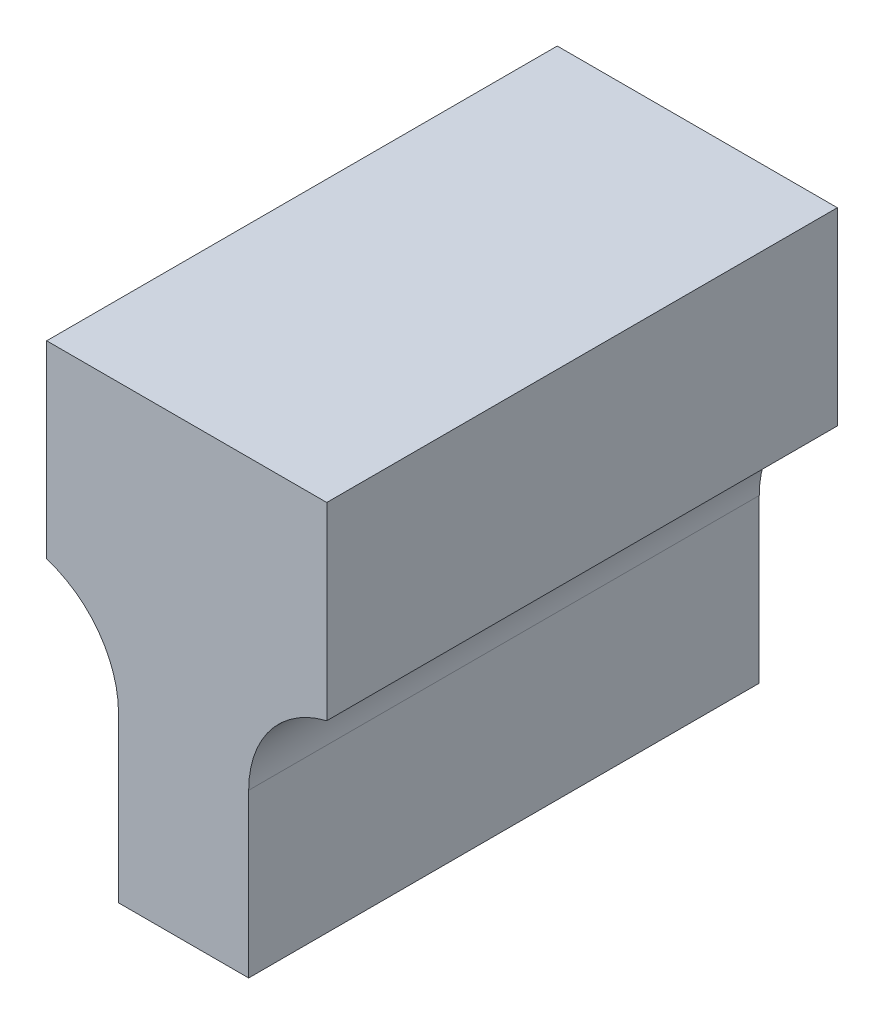
ISO-10303-21;
HEADER;
FILE_DESCRIPTION(('STEP AP214'),'2;1');
FILE_NAME('part.step','',(''),(''),'','','');
FILE_SCHEMA(('AUTOMOTIVE_DESIGN { 1 0 10303 214 1 1 1 1 }'));
ENDSEC;
DATA;
#1=APPLICATION_CONTEXT('core data for automotive mechanical design processes');
#2=APPLICATION_PROTOCOL_DEFINITION('international standard','automotive_design',2000,#1);
#3=PRODUCT_CONTEXT('',#1,'mechanical');
#4=PRODUCT('Part','Part','',(#3));
#5=PRODUCT_RELATED_PRODUCT_CATEGORY('part','',(#4));
#6=PRODUCT_DEFINITION_FORMATION('','',#4);
#7=PRODUCT_DEFINITION_CONTEXT('part definition',#1,'design');
#8=PRODUCT_DEFINITION('design','',#6,#7);
#9=PRODUCT_DEFINITION_SHAPE('','',#8);
#10=(LENGTH_UNIT() NAMED_UNIT(*) SI_UNIT(.MILLI.,.METRE.));
#11=(NAMED_UNIT(*) PLANE_ANGLE_UNIT() SI_UNIT($,.RADIAN.));
#12=(NAMED_UNIT(*) SI_UNIT($,.STERADIAN.) SOLID_ANGLE_UNIT());
#13=UNCERTAINTY_MEASURE_WITH_UNIT(LENGTH_MEASURE(1.E-05),#10,'distance_accuracy_value','');
#14=(GEOMETRIC_REPRESENTATION_CONTEXT(3) GLOBAL_UNCERTAINTY_ASSIGNED_CONTEXT((#13)) GLOBAL_UNIT_ASSIGNED_CONTEXT((#10,
#11,#12)) REPRESENTATION_CONTEXT('',''));
#15=CARTESIAN_POINT('',(0.,0.,0.));
#16=DIRECTION('',(0.,0.,1.));
#17=DIRECTION('',(1.,0.,0.));
#18=AXIS2_PLACEMENT_3D('',#15,#16,#17);
#19=CARTESIAN_POINT('',(1.40741424944014,0.,10.));
#20=DIRECTION('',(1.,0.,0.));
#21=DIRECTION('',(0.,0.,-1.));
#22=AXIS2_PLACEMENT_3D('',#19,#20,#21);
#23=PLANE('',#22);
#24=DIRECTION('',(0.,-1.,0.));
#25=VECTOR('',#24,1.);
#26=CARTESIAN_POINT('',(1.40741424944014,0.,10.));
#27=LINE('',#26,#25);
#28=CARTESIAN_POINT('',(1.40741424944014,-1.91019426452741,10.));
#29=VERTEX_POINT('',#28);
#30=CARTESIAN_POINT('',(1.40741424944014,-5.12817714711396,10.));
#31=VERTEX_POINT('',#30);
#32=EDGE_CURVE('E95',#29,#31,#27,.T.);
#33=ORIENTED_EDGE('',*,*,#32,.F.);
#34=DIRECTION('',(0.,0.,1.));
#35=VECTOR('',#34,1.);
#36=CARTESIAN_POINT('',(1.40741424944014,-1.91019426452741,10.));
#37=LINE('',#36,#35);
#38=CARTESIAN_POINT('',(1.40741424944014,-1.91019426452741,0.));
#39=VERTEX_POINT('',#38);
#40=EDGE_CURVE('E153',#29,#39,#37,.F.);
#41=ORIENTED_EDGE('',*,*,#40,.T.);
#42=DIRECTION('',(0.,-1.,0.));
#43=VECTOR('',#42,1.);
#44=CARTESIAN_POINT('',(1.40741424944014,0.,0.));
#45=LINE('',#44,#43);
#46=CARTESIAN_POINT('',(1.40741424944014,-5.12817714711396,0.));
#47=VERTEX_POINT('',#46);
#48=EDGE_CURVE('E108',#39,#47,#45,.T.);
#49=ORIENTED_EDGE('',*,*,#48,.T.);
#50=DIRECTION('',(0.,0.,-1.));
#51=VECTOR('',#50,1.);
#52=CARTESIAN_POINT('',(1.40741424944014,-5.12817714711396,10.));
#53=LINE('',#52,#51);
#54=EDGE_CURVE('E106',#31,#47,#53,.T.);
#55=ORIENTED_EDGE('',*,*,#54,.F.);
#56=EDGE_LOOP('',(#33,#41,#49,#55));
#57=FACE_BOUND('',#56,.T.);
#58=ADVANCED_FACE('F33',(#57),#23,.F.);
#59=CARTESIAN_POINT('',(0.,-5.12817714711396,10.));
#60=DIRECTION('',(0.,1.,0.));
#61=DIRECTION('',(0.,0.,1.));
#62=AXIS2_PLACEMENT_3D('',#59,#60,#61);
#63=PLANE('',#62);
#64=DIRECTION('',(1.,0.,0.));
#65=VECTOR('',#64,1.);
#66=CARTESIAN_POINT('',(0.,-5.12817714711396,0.));
#67=LINE('',#66,#65);
#68=CARTESIAN_POINT('',(3.95632164973914,-5.12817714711396,0.));
#69=VERTEX_POINT('',#68);
#70=EDGE_CURVE('E131',#47,#69,#67,.T.);
#71=ORIENTED_EDGE('',*,*,#70,.T.);
#72=DIRECTION('',(0.,0.,-1.));
#73=VECTOR('',#72,1.);
#74=CARTESIAN_POINT('',(3.95632164973914,-5.12817714711396,10.));
#75=LINE('',#74,#73);
#76=CARTESIAN_POINT('',(3.95632164973914,-5.12817714711396,10.));
#77=VERTEX_POINT('',#76);
#78=EDGE_CURVE('E113',#77,#69,#75,.T.);
#79=ORIENTED_EDGE('',*,*,#78,.F.);
#80=DIRECTION('',(1.,0.,0.));
#81=VECTOR('',#80,1.);
#82=CARTESIAN_POINT('',(0.,-5.12817714711396,10.));
#83=LINE('',#82,#81);
#84=EDGE_CURVE('E100',#31,#77,#83,.T.);
#85=ORIENTED_EDGE('',*,*,#84,.F.);
#86=ORIENTED_EDGE('',*,*,#54,.T.);
#87=EDGE_LOOP('',(#71,#79,#85,#86));
#88=FACE_BOUND('',#87,.T.);
#89=ADVANCED_FACE('F115',(#88),#63,.F.);
#90=CARTESIAN_POINT('',(3.95632164973914,0.,10.));
#91=DIRECTION('',(1.,0.,0.));
#92=DIRECTION('',(0.,0.,-1.));
#93=AXIS2_PLACEMENT_3D('',#90,#91,#92);
#94=PLANE('',#93);
#95=DIRECTION('',(0.,-1.,0.));
#96=VECTOR('',#95,1.);
#97=CARTESIAN_POINT('',(3.95632164973914,0.,0.));
#98=LINE('',#97,#96);
#99=CARTESIAN_POINT('',(3.95632164973914,-1.94383212855688,0.));
#100=VERTEX_POINT('',#99);
#101=EDGE_CURVE('E133',#100,#69,#98,.T.);
#102=ORIENTED_EDGE('',*,*,#101,.F.);
#103=DIRECTION('',(0.,0.,-1.));
#104=VECTOR('',#103,1.);
#105=CARTESIAN_POINT('',(3.95632164973914,-1.94383212855688,10.));
#106=LINE('',#105,#104);
#107=CARTESIAN_POINT('',(3.95632164973914,-1.94383212855688,10.));
#108=VERTEX_POINT('',#107);
#109=EDGE_CURVE('E112',#100,#108,#106,.F.);
#110=ORIENTED_EDGE('',*,*,#109,.T.);
#111=DIRECTION('',(0.,-1.,0.));
#112=VECTOR('',#111,1.);
#113=CARTESIAN_POINT('',(3.95632164973914,0.,10.));
#114=LINE('',#113,#112);
#115=EDGE_CURVE('E117',#108,#77,#114,.T.);
#116=ORIENTED_EDGE('',*,*,#115,.T.);
#117=ORIENTED_EDGE('',*,*,#78,.T.);
#118=EDGE_LOOP('',(#102,#110,#116,#117));
#119=FACE_BOUND('',#118,.T.);
#120=ADVANCED_FACE('F175',(#119),#94,.T.);
#121=CARTESIAN_POINT('',(5.48566608991854,0.,10.));
#122=DIRECTION('',(-1.,0.,0.));
#123=DIRECTION('',(0.,0.,1.));
#124=AXIS2_PLACEMENT_3D('',#121,#122,#123);
#125=PLANE('',#124);
#126=DIRECTION('',(0.,1.,0.));
#127=VECTOR('',#126,1.);
#128=CARTESIAN_POINT('',(5.48566608991854,0.,0.));
#129=LINE('',#128,#127);
#130=CARTESIAN_POINT('',(5.48566608991854,0.,0.));
#131=VERTEX_POINT('',#130);
#132=CARTESIAN_POINT('',(5.48566608991854,3.70196634677899,0.));
#133=VERTEX_POINT('',#132);
#134=EDGE_CURVE('E135',#131,#133,#129,.T.);
#135=ORIENTED_EDGE('',*,*,#134,.T.);
#136=DIRECTION('',(0.,0.,-1.));
#137=VECTOR('',#136,1.);
#138=CARTESIAN_POINT('',(5.48566608991854,3.70196634677899,10.));
#139=LINE('',#138,#137);
#140=CARTESIAN_POINT('',(5.48566608991854,3.70196634677899,10.));
#141=VERTEX_POINT('',#140);
#142=EDGE_CURVE('E146',#141,#133,#139,.T.);
#143=ORIENTED_EDGE('',*,*,#142,.F.);
#144=DIRECTION('',(0.,1.,0.));
#145=VECTOR('',#144,1.);
#146=CARTESIAN_POINT('',(5.48566608991854,0.,10.));
#147=LINE('',#146,#145);
#148=CARTESIAN_POINT('',(5.48566608991854,0.,10.));
#149=VERTEX_POINT('',#148);
#150=EDGE_CURVE('E119',#149,#141,#147,.T.);
#151=ORIENTED_EDGE('',*,*,#150,.F.);
#152=DIRECTION('',(0.,0.,-1.));
#153=VECTOR('',#152,1.);
#154=CARTESIAN_POINT('',(5.48566608991854,0.,10.));
#155=LINE('',#154,#153);
#156=EDGE_CURVE('E148',#149,#131,#155,.T.);
#157=ORIENTED_EDGE('',*,*,#156,.T.);
#158=EDGE_LOOP('',(#135,#143,#151,#157));
#159=FACE_BOUND('',#158,.T.);
#160=ADVANCED_FACE('F180',(#159),#125,.F.);
#161=CARTESIAN_POINT('',(0.,3.70196634677899,10.));
#162=DIRECTION('',(0.,1.,0.));
#163=DIRECTION('',(0.,0.,1.));
#164=AXIS2_PLACEMENT_3D('',#161,#162,#163);
#165=PLANE('',#164);
#166=DIRECTION('',(1.,0.,0.));
#167=VECTOR('',#166,1.);
#168=CARTESIAN_POINT('',(0.,3.70196634677899,0.));
#169=LINE('',#168,#167);
#170=CARTESIAN_POINT('',(0.,3.70196634677899,0.));
#171=VERTEX_POINT('',#170);
#172=EDGE_CURVE('E138',#171,#133,#169,.T.);
#173=ORIENTED_EDGE('',*,*,#172,.F.);
#174=DIRECTION('',(0.,0.,-1.));
#175=VECTOR('',#174,1.);
#176=CARTESIAN_POINT('',(0.,3.70196634677899,10.));
#177=LINE('',#176,#175);
#178=CARTESIAN_POINT('',(0.,3.70196634677899,10.));
#179=VERTEX_POINT('',#178);
#180=EDGE_CURVE('E144',#179,#171,#177,.T.);
#181=ORIENTED_EDGE('',*,*,#180,.F.);
#182=DIRECTION('',(1.,0.,0.));
#183=VECTOR('',#182,1.);
#184=CARTESIAN_POINT('',(0.,3.70196634677899,10.));
#185=LINE('',#184,#183);
#186=EDGE_CURVE('E123',#179,#141,#185,.T.);
#187=ORIENTED_EDGE('',*,*,#186,.T.);
#188=ORIENTED_EDGE('',*,*,#142,.T.);
#189=EDGE_LOOP('',(#173,#181,#187,#188));
#190=FACE_BOUND('',#189,.T.);
#191=ADVANCED_FACE('F184',(#190),#165,.T.);
#192=CARTESIAN_POINT('',(0.,0.,10.));
#193=DIRECTION('',(-1.,0.,0.));
#194=DIRECTION('',(0.,0.,1.));
#195=AXIS2_PLACEMENT_3D('',#192,#193,#194);
#196=PLANE('',#195);
#197=DIRECTION('',(0.,1.,0.));
#198=VECTOR('',#197,1.);
#199=CARTESIAN_POINT('',(0.,0.,0.));
#200=LINE('',#199,#198);
#201=CARTESIAN_POINT('',(0.,0.,0.));
#202=VERTEX_POINT('',#201);
#203=EDGE_CURVE('E103',#202,#171,#200,.T.);
#204=ORIENTED_EDGE('',*,*,#203,.F.);
#205=DIRECTION('',(0.,0.,-1.));
#206=VECTOR('',#205,1.);
#207=CARTESIAN_POINT('',(0.,0.,10.));
#208=LINE('',#207,#206);
#209=CARTESIAN_POINT('',(0.,0.,10.));
#210=VERTEX_POINT('',#209);
#211=EDGE_CURVE('E129',#210,#202,#208,.T.);
#212=ORIENTED_EDGE('',*,*,#211,.F.);
#213=DIRECTION('',(0.,1.,0.));
#214=VECTOR('',#213,1.);
#215=CARTESIAN_POINT('',(0.,0.,10.));
#216=LINE('',#215,#214);
#217=EDGE_CURVE('E126',#210,#179,#216,.T.);
#218=ORIENTED_EDGE('',*,*,#217,.T.);
#219=ORIENTED_EDGE('',*,*,#180,.T.);
#220=EDGE_LOOP('',(#204,#212,#218,#219));
#221=FACE_BOUND('',#220,.T.);
#222=ADVANCED_FACE('F162',(#221),#196,.T.);
#223=CARTESIAN_POINT('',(0.,0.,10.));
#224=DIRECTION('',(0.,0.,1.));
#225=DIRECTION('',(1.,0.,0.));
#226=AXIS2_PLACEMENT_3D('',#223,#224,#225);
#227=PLANE('',#226);
#228=ORIENTED_EDGE('',*,*,#217,.F.);
#229=CARTESIAN_POINT('',(-0.592585750559859,-1.91019426452741,10.));
#230=DIRECTION('',(0.,0.,1.));
#231=DIRECTION('',(1.,0.,0.));
#232=AXIS2_PLACEMENT_3D('',#229,#230,#231);
#233=CIRCLE('',#232,2.);
#234=EDGE_CURVE('E11',#210,#29,#233,.F.);
#235=ORIENTED_EDGE('',*,*,#234,.T.);
#236=ORIENTED_EDGE('',*,*,#32,.T.);
#237=ORIENTED_EDGE('',*,*,#84,.T.);
#238=ORIENTED_EDGE('',*,*,#115,.F.);
#239=CARTESIAN_POINT('',(5.95632164973914,-1.94383212855688,10.));
#240=DIRECTION('',(0.,0.,1.));
#241=DIRECTION('',(1.,0.,0.));
#242=AXIS2_PLACEMENT_3D('',#239,#240,#241);
#243=CIRCLE('',#242,2.);
#244=EDGE_CURVE('E157',#108,#149,#243,.F.);
#245=ORIENTED_EDGE('',*,*,#244,.T.);
#246=ORIENTED_EDGE('',*,*,#150,.T.);
#247=ORIENTED_EDGE('',*,*,#186,.F.);
#248=EDGE_LOOP('',(#228,#235,#236,#237,#238,#245,#246,#247));
#249=FACE_BOUND('',#248,.T.);
#250=ADVANCED_FACE('F97',(#249),#227,.T.);
#251=CARTESIAN_POINT('',(0.,0.,0.));
#252=DIRECTION('',(0.,0.,1.));
#253=DIRECTION('',(1.,0.,0.));
#254=AXIS2_PLACEMENT_3D('',#251,#252,#253);
#255=PLANE('',#254);
#256=ORIENTED_EDGE('',*,*,#48,.F.);
#257=CARTESIAN_POINT('',(-0.592585750559859,-1.91019426452741,0.));
#258=DIRECTION('',(0.,0.,1.));
#259=DIRECTION('',(1.,0.,0.));
#260=AXIS2_PLACEMENT_3D('',#257,#258,#259);
#261=CIRCLE('',#260,2.);
#262=EDGE_CURVE('E41',#39,#202,#261,.T.);
#263=ORIENTED_EDGE('',*,*,#262,.T.);
#264=ORIENTED_EDGE('',*,*,#203,.T.);
#265=ORIENTED_EDGE('',*,*,#172,.T.);
#266=ORIENTED_EDGE('',*,*,#134,.F.);
#267=CARTESIAN_POINT('',(5.95632164973914,-1.94383212855688,0.));
#268=DIRECTION('',(0.,0.,1.));
#269=DIRECTION('',(1.,0.,0.));
#270=AXIS2_PLACEMENT_3D('',#267,#268,#269);
#271=CIRCLE('',#270,2.);
#272=EDGE_CURVE('E155',#131,#100,#271,.T.);
#273=ORIENTED_EDGE('',*,*,#272,.T.);
#274=ORIENTED_EDGE('',*,*,#101,.T.);
#275=ORIENTED_EDGE('',*,*,#70,.F.);
#276=EDGE_LOOP('',(#256,#263,#264,#265,#266,#273,#274,#275));
#277=FACE_BOUND('',#276,.T.);
#278=ADVANCED_FACE('F160',(#277),#255,.F.);
#279=CARTESIAN_POINT('',(5.95632164973914,-1.94383212855688,10.));
#280=DIRECTION('',(0.,0.,1.));
#281=DIRECTION('',(1.,0.,0.));
#282=AXIS2_PLACEMENT_3D('',#279,#280,#281);
#283=CYLINDRICAL_SURFACE('',#282,2.);
#284=ORIENTED_EDGE('',*,*,#244,.F.);
#285=ORIENTED_EDGE('',*,*,#109,.F.);
#286=ORIENTED_EDGE('',*,*,#272,.F.);
#287=ORIENTED_EDGE('',*,*,#156,.F.);
#288=EDGE_LOOP('',(#284,#285,#286,#287));
#289=FACE_BOUND('',#288,.T.);
#290=ADVANCED_FACE('F165',(#289),#283,.F.);
#291=CARTESIAN_POINT('',(-0.592585750559859,-1.91019426452741,10.));
#292=DIRECTION('',(0.,0.,1.));
#293=DIRECTION('',(1.,0.,0.));
#294=AXIS2_PLACEMENT_3D('',#291,#292,#293);
#295=CYLINDRICAL_SURFACE('',#294,2.);
#296=ORIENTED_EDGE('',*,*,#234,.F.);
#297=ORIENTED_EDGE('',*,*,#211,.T.);
#298=ORIENTED_EDGE('',*,*,#262,.F.);
#299=ORIENTED_EDGE('',*,*,#40,.F.);
#300=EDGE_LOOP('',(#296,#297,#298,#299));
#301=FACE_BOUND('',#300,.T.);
#302=ADVANCED_FACE('F35',(#301),#295,.F.);
#303=CLOSED_SHELL('',(#58,#89,#120,#160,#191,#222,#250,#278,#290,#302));
#304=MANIFOLD_SOLID_BREP('B2',#303);
#305=ADVANCED_BREP_SHAPE_REPRESENTATION('',(#18,#304),#14);
#306=SHAPE_DEFINITION_REPRESENTATION(#9,#305);
ENDSEC;
END-ISO-10303-21;
